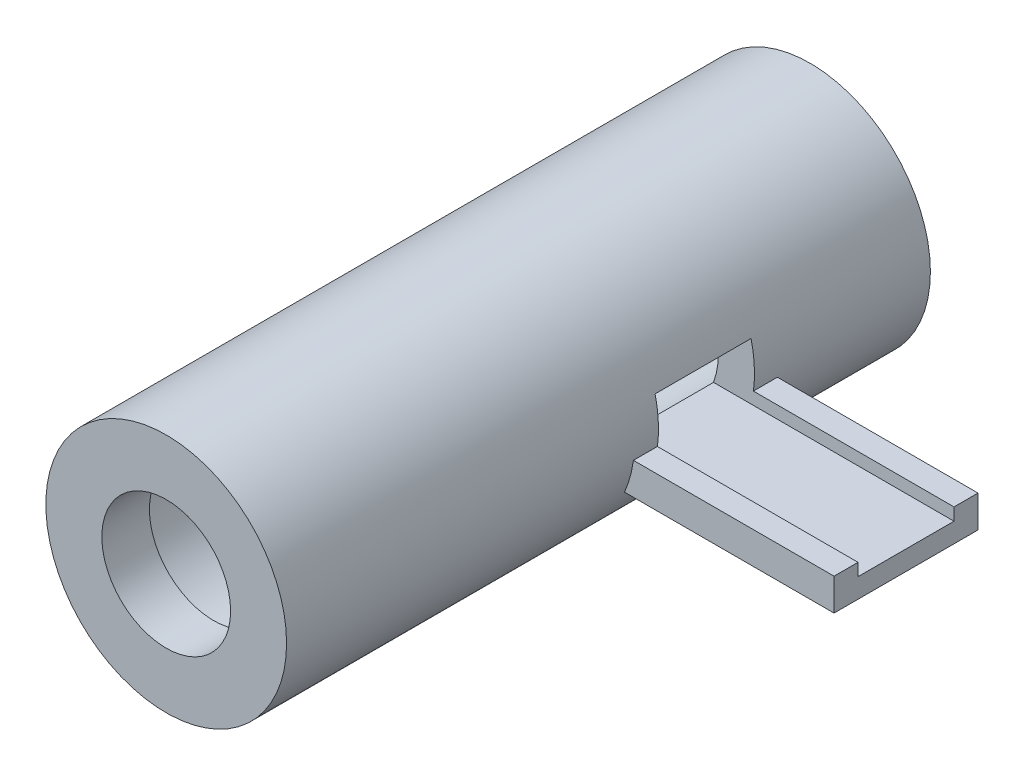
ISO-10303-21;
HEADER;
FILE_DESCRIPTION(('STEP AP214'),'2;1');
FILE_NAME('part.step','',(''),(''),'','','');
FILE_SCHEMA(('AUTOMOTIVE_DESIGN { 1 0 10303 214 1 1 1 1 }'));
ENDSEC;
DATA;
#1=APPLICATION_CONTEXT('core data for automotive mechanical design processes');
#2=APPLICATION_PROTOCOL_DEFINITION('international standard','automotive_design',2000,#1);
#3=PRODUCT_CONTEXT('',#1,'mechanical');
#4=PRODUCT('Part','Part','',(#3));
#5=PRODUCT_RELATED_PRODUCT_CATEGORY('part','',(#4));
#6=PRODUCT_DEFINITION_FORMATION('','',#4);
#7=PRODUCT_DEFINITION_CONTEXT('part definition',#1,'design');
#8=PRODUCT_DEFINITION('design','',#6,#7);
#9=PRODUCT_DEFINITION_SHAPE('','',#8);
#10=(LENGTH_UNIT() NAMED_UNIT(*) SI_UNIT(.MILLI.,.METRE.));
#11=(NAMED_UNIT(*) PLANE_ANGLE_UNIT() SI_UNIT($,.RADIAN.));
#12=(NAMED_UNIT(*) SI_UNIT($,.STERADIAN.) SOLID_ANGLE_UNIT());
#13=UNCERTAINTY_MEASURE_WITH_UNIT(LENGTH_MEASURE(1.E-05),#10,'distance_accuracy_value','');
#14=(GEOMETRIC_REPRESENTATION_CONTEXT(3) GLOBAL_UNCERTAINTY_ASSIGNED_CONTEXT((#13)) GLOBAL_UNIT_ASSIGNED_CONTEXT((#10,
#11,#12)) REPRESENTATION_CONTEXT('',''));
#15=CARTESIAN_POINT('',(0.,0.,0.));
#16=DIRECTION('',(0.,0.,1.));
#17=DIRECTION('',(1.,0.,0.));
#18=AXIS2_PLACEMENT_3D('',#15,#16,#17);
#19=CARTESIAN_POINT('',(0.,0.,0.));
#20=DIRECTION('',(0.,0.,1.));
#21=DIRECTION('',(1.,0.,0.));
#22=AXIS2_PLACEMENT_3D('',#19,#20,#21);
#23=CYLINDRICAL_SURFACE('',#22,15.05);
#24=CARTESIAN_POINT('',(0.,0.,-80.5));
#25=DIRECTION('',(0.,0.,1.));
#26=DIRECTION('',(1.,0.,0.));
#27=AXIS2_PLACEMENT_3D('',#24,#25,#26);
#28=CIRCLE('',#27,15.05);
#29=CARTESIAN_POINT('',(15.05,0.,-80.5));
#30=VERTEX_POINT('',#29);
#31=EDGE_CURVE('E161',#30,#30,#28,.T.);
#32=ORIENTED_EDGE('',*,*,#31,.T.);
#33=EDGE_LOOP('',(#32));
#34=FACE_BOUND('',#33,.T.);
#35=CARTESIAN_POINT('',(0.,0.,0.));
#36=DIRECTION('',(0.,0.,1.));
#37=DIRECTION('',(1.,0.,0.));
#38=AXIS2_PLACEMENT_3D('',#35,#36,#37);
#39=CIRCLE('',#38,15.05);
#40=CARTESIAN_POINT('',(15.05,0.,0.));
#41=VERTEX_POINT('',#40);
#42=EDGE_CURVE('E164',#41,#41,#39,.T.);
#43=ORIENTED_EDGE('',*,*,#42,.F.);
#44=EDGE_LOOP('',(#43));
#45=FACE_BOUND('',#44,.T.);
#46=CARTESIAN_POINT('',(0.,0.,-43.5));
#47=DIRECTION('',(0.,0.,-1.));
#48=DIRECTION('',(-1.,0.,0.));
#49=AXIS2_PLACEMENT_3D('',#46,#47,#48);
#50=CIRCLE('',#49,15.05);
#51=CARTESIAN_POINT('',(13.8022643069896,-6.,-43.5));
#52=VERTEX_POINT('',#51);
#53=CARTESIAN_POINT('',(14.9165176901313,-2.,-43.5));
#54=VERTEX_POINT('',#53);
#55=EDGE_CURVE('E134',#52,#54,#50,.F.);
#56=ORIENTED_EDGE('',*,*,#55,.T.);
#57=DIRECTION('',(0.,0.,1.));
#58=VECTOR('',#57,1.);
#59=CARTESIAN_POINT('',(14.9165176901313,-2.,0.));
#60=LINE('',#59,#58);
#61=CARTESIAN_POINT('',(14.9165176901313,-2.,-46.5));
#62=VERTEX_POINT('',#61);
#63=EDGE_CURVE('E238',#54,#62,#60,.F.);
#64=ORIENTED_EDGE('',*,*,#63,.T.);
#65=CARTESIAN_POINT('',(0.,0.,-46.5));
#66=DIRECTION('',(0.,0.,-1.));
#67=DIRECTION('',(-1.,0.,0.));
#68=AXIS2_PLACEMENT_3D('',#65,#66,#67);
#69=CIRCLE('',#68,15.05);
#70=CARTESIAN_POINT('',(14.6253205093085,3.55,-46.5));
#71=VERTEX_POINT('',#70);
#72=EDGE_CURVE('E50',#62,#71,#69,.F.);
#73=ORIENTED_EDGE('',*,*,#72,.T.);
#74=DIRECTION('',(0.,0.,1.));
#75=VECTOR('',#74,1.);
#76=CARTESIAN_POINT('',(14.6253205093085,3.54999999999998,0.));
#77=LINE('',#76,#75);
#78=CARTESIAN_POINT('',(14.6253205093085,3.55,-58.5));
#79=VERTEX_POINT('',#78);
#80=EDGE_CURVE('E147',#71,#79,#77,.F.);
#81=ORIENTED_EDGE('',*,*,#80,.T.);
#82=CARTESIAN_POINT('',(0.,0.,-58.5));
#83=DIRECTION('',(0.,0.,1.));
#84=DIRECTION('',(0.,-1.,0.));
#85=AXIS2_PLACEMENT_3D('',#82,#83,#84);
#86=CIRCLE('',#85,15.05);
#87=CARTESIAN_POINT('',(14.9165176901313,-2.,-58.5));
#88=VERTEX_POINT('',#87);
#89=EDGE_CURVE('E149',#79,#88,#86,.F.);
#90=ORIENTED_EDGE('',*,*,#89,.T.);
#91=DIRECTION('',(0.,0.,1.));
#92=VECTOR('',#91,1.);
#93=CARTESIAN_POINT('',(14.9165176901313,-2.,0.));
#94=LINE('',#93,#92);
#95=CARTESIAN_POINT('',(14.9165176901313,-2.,-61.5));
#96=VERTEX_POINT('',#95);
#97=EDGE_CURVE('E241',#88,#96,#94,.F.);
#98=ORIENTED_EDGE('',*,*,#97,.T.);
#99=CARTESIAN_POINT('',(0.,0.,-61.5));
#100=DIRECTION('',(0.,0.,1.));
#101=DIRECTION('',(1.,0.,0.));
#102=AXIS2_PLACEMENT_3D('',#99,#100,#101);
#103=CIRCLE('',#102,15.05);
#104=CARTESIAN_POINT('',(13.8022643069896,-6.,-61.5));
#105=VERTEX_POINT('',#104);
#106=EDGE_CURVE('E250',#96,#105,#103,.F.);
#107=ORIENTED_EDGE('',*,*,#106,.T.);
#108=DIRECTION('',(0.,0.,1.));
#109=VECTOR('',#108,1.);
#110=CARTESIAN_POINT('',(13.8022643069896,-5.99999999999999,0.));
#111=LINE('',#110,#109);
#112=EDGE_CURVE('E139',#105,#52,#111,.T.);
#113=ORIENTED_EDGE('',*,*,#112,.T.);
#114=EDGE_LOOP('',(#56,#64,#73,#81,#90,#98,#107,#113));
#115=FACE_BOUND('',#114,.T.);
#116=ADVANCED_FACE('F35',(#34,#45,#115),#23,.T.);
#117=CARTESIAN_POINT('',(0.,0.,0.));
#118=DIRECTION('',(0.,0.,1.));
#119=DIRECTION('',(1.,0.,0.));
#120=AXIS2_PLACEMENT_3D('',#117,#118,#119);
#121=CYLINDRICAL_SURFACE('',#120,10.55);
#122=DIRECTION('',(0.,0.,1.));
#123=VECTOR('',#122,1.);
#124=CARTESIAN_POINT('',(9.93478736561583,-3.55000000000001,-80.5));
#125=LINE('',#124,#123);
#126=CARTESIAN_POINT('',(9.93478736561583,-3.55000000000001,-58.5));
#127=VERTEX_POINT('',#126);
#128=CARTESIAN_POINT('',(9.93478736561583,-3.55000000000001,-46.5));
#129=VERTEX_POINT('',#128);
#130=EDGE_CURVE('E114',#127,#129,#125,.T.);
#131=ORIENTED_EDGE('',*,*,#130,.F.);
#132=CARTESIAN_POINT('',(0.,0.,-58.5));
#133=DIRECTION('',(0.,0.,1.));
#134=DIRECTION('',(0.,-1.,0.));
#135=AXIS2_PLACEMENT_3D('',#132,#133,#134);
#136=CIRCLE('',#135,10.55);
#137=CARTESIAN_POINT('',(9.93478736561584,3.55,-58.5));
#138=VERTEX_POINT('',#137);
#139=EDGE_CURVE('E11',#127,#138,#136,.T.);
#140=ORIENTED_EDGE('',*,*,#139,.T.);
#141=DIRECTION('',(0.,0.,1.));
#142=VECTOR('',#141,1.);
#143=CARTESIAN_POINT('',(9.93478736561585,3.54999999999998,0.));
#144=LINE('',#143,#142);
#145=CARTESIAN_POINT('',(9.93478736561584,3.55,-46.5));
#146=VERTEX_POINT('',#145);
#147=EDGE_CURVE('E43',#138,#146,#144,.T.);
#148=ORIENTED_EDGE('',*,*,#147,.T.);
#149=CARTESIAN_POINT('',(0.,0.,-46.5));
#150=DIRECTION('',(0.,0.,-1.));
#151=DIRECTION('',(-1.,0.,0.));
#152=AXIS2_PLACEMENT_3D('',#149,#150,#151);
#153=CIRCLE('',#152,10.55);
#154=EDGE_CURVE('E110',#146,#129,#153,.T.);
#155=ORIENTED_EDGE('',*,*,#154,.T.);
#156=EDGE_LOOP('',(#131,#140,#148,#155));
#157=FACE_BOUND('',#156,.T.);
#158=CARTESIAN_POINT('',(0.,0.,-5.95));
#159=DIRECTION('',(0.,0.,1.));
#160=DIRECTION('',(1.,0.,0.));
#161=AXIS2_PLACEMENT_3D('',#158,#159,#160);
#162=CIRCLE('',#161,10.55);
#163=CARTESIAN_POINT('',(10.55,0.,-5.95));
#164=VERTEX_POINT('',#163);
#165=EDGE_CURVE('E155',#164,#164,#162,.T.);
#166=ORIENTED_EDGE('',*,*,#165,.T.);
#167=EDGE_LOOP('',(#166));
#168=FACE_BOUND('',#167,.T.);
#169=CARTESIAN_POINT('',(0.,0.,-80.5));
#170=DIRECTION('',(0.,0.,1.));
#171=DIRECTION('',(1.,0.,0.));
#172=AXIS2_PLACEMENT_3D('',#169,#170,#171);
#173=CIRCLE('',#172,10.55);
#174=CARTESIAN_POINT('',(10.55,0.,-80.5));
#175=VERTEX_POINT('',#174);
#176=EDGE_CURVE('E158',#175,#175,#173,.T.);
#177=ORIENTED_EDGE('',*,*,#176,.F.);
#178=EDGE_LOOP('',(#177));
#179=FACE_BOUND('',#178,.T.);
#180=ADVANCED_FACE('F112',(#157,#168,#179),#121,.F.);
#181=CARTESIAN_POINT('',(0.,0.,0.));
#182=DIRECTION('',(0.,0.,1.));
#183=DIRECTION('',(1.,0.,0.));
#184=AXIS2_PLACEMENT_3D('',#181,#182,#183);
#185=CYLINDRICAL_SURFACE('',#184,8.05);
#186=CARTESIAN_POINT('',(0.,0.,0.));
#187=DIRECTION('',(0.,0.,1.));
#188=DIRECTION('',(1.,0.,0.));
#189=AXIS2_PLACEMENT_3D('',#186,#187,#188);
#190=CIRCLE('',#189,8.05);
#191=CARTESIAN_POINT('',(8.05,0.,0.));
#192=VERTEX_POINT('',#191);
#193=EDGE_CURVE('E119',#192,#192,#190,.T.);
#194=ORIENTED_EDGE('',*,*,#193,.T.);
#195=EDGE_LOOP('',(#194));
#196=FACE_BOUND('',#195,.T.);
#197=CARTESIAN_POINT('',(0.,0.,-5.95));
#198=DIRECTION('',(0.,0.,1.));
#199=DIRECTION('',(1.,0.,0.));
#200=AXIS2_PLACEMENT_3D('',#197,#198,#199);
#201=CIRCLE('',#200,8.05);
#202=CARTESIAN_POINT('',(8.05,0.,-5.95));
#203=VERTEX_POINT('',#202);
#204=EDGE_CURVE('E152',#203,#203,#201,.T.);
#205=ORIENTED_EDGE('',*,*,#204,.F.);
#206=EDGE_LOOP('',(#205));
#207=FACE_BOUND('',#206,.T.);
#208=ADVANCED_FACE('F37',(#196,#207),#185,.F.);
#209=CARTESIAN_POINT('',(8.05,0.,0.));
#210=DIRECTION('',(0.,0.,1.));
#211=DIRECTION('',(1.,0.,0.));
#212=AXIS2_PLACEMENT_3D('',#209,#210,#211);
#213=PLANE('',#212);
#214=ORIENTED_EDGE('',*,*,#42,.T.);
#215=EDGE_LOOP('',(#214));
#216=FACE_BOUND('',#215,.T.);
#217=ORIENTED_EDGE('',*,*,#193,.F.);
#218=EDGE_LOOP('',(#217));
#219=FACE_BOUND('',#218,.T.);
#220=ADVANCED_FACE('F172',(#216,#219),#213,.T.);
#221=CARTESIAN_POINT('',(15.05,0.,-80.5));
#222=DIRECTION('',(0.,0.,-1.));
#223=DIRECTION('',(-1.,0.,0.));
#224=AXIS2_PLACEMENT_3D('',#221,#222,#223);
#225=PLANE('',#224);
#226=ORIENTED_EDGE('',*,*,#176,.T.);
#227=EDGE_LOOP('',(#226));
#228=FACE_BOUND('',#227,.T.);
#229=ORIENTED_EDGE('',*,*,#31,.F.);
#230=EDGE_LOOP('',(#229));
#231=FACE_BOUND('',#230,.T.);
#232=ADVANCED_FACE('F174',(#228,#231),#225,.T.);
#233=CARTESIAN_POINT('',(10.55,0.,-5.95));
#234=DIRECTION('',(0.,0.,-1.));
#235=DIRECTION('',(-1.,0.,0.));
#236=AXIS2_PLACEMENT_3D('',#233,#234,#235);
#237=PLANE('',#236);
#238=ORIENTED_EDGE('',*,*,#204,.T.);
#239=EDGE_LOOP('',(#238));
#240=FACE_BOUND('',#239,.T.);
#241=ORIENTED_EDGE('',*,*,#165,.F.);
#242=EDGE_LOOP('',(#241));
#243=FACE_BOUND('',#242,.T.);
#244=ADVANCED_FACE('F180',(#240,#243),#237,.T.);
#245=CARTESIAN_POINT('',(30.,-3.55000000000001,0.));
#246=DIRECTION('',(0.,-1.,0.));
#247=DIRECTION('',(0.,0.,-1.));
#248=AXIS2_PLACEMENT_3D('',#245,#246,#247);
#249=PLANE('',#248);
#250=DIRECTION('',(-1.,0.,0.));
#251=VECTOR('',#250,1.);
#252=CARTESIAN_POINT('',(30.,-3.55000000000001,-58.5));
#253=LINE('',#252,#251);
#254=CARTESIAN_POINT('',(40.,-3.55000000000001,-58.5));
#255=VERTEX_POINT('',#254);
#256=EDGE_CURVE('E126',#255,#127,#253,.T.);
#257=ORIENTED_EDGE('',*,*,#256,.T.);
#258=ORIENTED_EDGE('',*,*,#130,.T.);
#259=DIRECTION('',(-1.,0.,0.));
#260=VECTOR('',#259,1.);
#261=CARTESIAN_POINT('',(30.,-3.55000000000001,-46.5));
#262=LINE('',#261,#260);
#263=CARTESIAN_POINT('',(40.,-3.55000000000001,-46.5));
#264=VERTEX_POINT('',#263);
#265=EDGE_CURVE('E124',#264,#129,#262,.T.);
#266=ORIENTED_EDGE('',*,*,#265,.F.);
#267=DIRECTION('',(0.,0.,1.));
#268=VECTOR('',#267,1.);
#269=CARTESIAN_POINT('',(40.,-3.55000000000001,-46.5));
#270=LINE('',#269,#268);
#271=EDGE_CURVE('E235',#255,#264,#270,.T.);
#272=ORIENTED_EDGE('',*,*,#271,.F.);
#273=EDGE_LOOP('',(#257,#258,#266,#272));
#274=FACE_BOUND('',#273,.T.);
#275=ADVANCED_FACE('F122',(#274),#249,.F.);
#276=CARTESIAN_POINT('',(30.,1.14345153064387E-13,-58.5));
#277=DIRECTION('',(0.,0.,1.));
#278=DIRECTION('',(0.,-1.,0.));
#279=AXIS2_PLACEMENT_3D('',#276,#277,#278);
#280=PLANE('',#279);
#281=ORIENTED_EDGE('',*,*,#139,.F.);
#282=ORIENTED_EDGE('',*,*,#256,.F.);
#283=DIRECTION('',(0.,-1.,0.));
#284=VECTOR('',#283,1.);
#285=CARTESIAN_POINT('',(40.,-3.55000000000001,-58.5));
#286=LINE('',#285,#284);
#287=CARTESIAN_POINT('',(40.,-2.,-58.5));
#288=VERTEX_POINT('',#287);
#289=EDGE_CURVE('E271',#288,#255,#286,.T.);
#290=ORIENTED_EDGE('',*,*,#289,.F.);
#291=DIRECTION('',(-1.,0.,0.));
#292=VECTOR('',#291,1.);
#293=CARTESIAN_POINT('',(40.,-2.,-58.5));
#294=LINE('',#293,#292);
#295=EDGE_CURVE('E265',#288,#88,#294,.T.);
#296=ORIENTED_EDGE('',*,*,#295,.T.);
#297=ORIENTED_EDGE('',*,*,#89,.F.);
#298=DIRECTION('',(-1.,0.,0.));
#299=VECTOR('',#298,1.);
#300=CARTESIAN_POINT('',(30.,3.55,-58.5));
#301=LINE('',#300,#299);
#302=EDGE_CURVE('E136',#79,#138,#301,.T.);
#303=ORIENTED_EDGE('',*,*,#302,.T.);
#304=EDGE_LOOP('',(#281,#282,#290,#296,#297,#303));
#305=FACE_BOUND('',#304,.T.);
#306=ADVANCED_FACE('F197',(#305),#280,.T.);
#307=CARTESIAN_POINT('',(30.,3.54999999999998,0.));
#308=DIRECTION('',(0.,-1.,0.));
#309=DIRECTION('',(0.,0.,-1.));
#310=AXIS2_PLACEMENT_3D('',#307,#308,#309);
#311=PLANE('',#310);
#312=DIRECTION('',(-1.,0.,0.));
#313=VECTOR('',#312,1.);
#314=CARTESIAN_POINT('',(30.,3.55,-46.5));
#315=LINE('',#314,#313);
#316=EDGE_CURVE('E133',#71,#146,#315,.T.);
#317=ORIENTED_EDGE('',*,*,#316,.T.);
#318=ORIENTED_EDGE('',*,*,#147,.F.);
#319=ORIENTED_EDGE('',*,*,#302,.F.);
#320=ORIENTED_EDGE('',*,*,#80,.F.);
#321=EDGE_LOOP('',(#317,#318,#319,#320));
#322=FACE_BOUND('',#321,.T.);
#323=ADVANCED_FACE('F200',(#322),#311,.T.);
#324=CARTESIAN_POINT('',(30.,0.,-46.5));
#325=DIRECTION('',(0.,0.,-1.));
#326=DIRECTION('',(-1.,0.,0.));
#327=AXIS2_PLACEMENT_3D('',#324,#325,#326);
#328=PLANE('',#327);
#329=ORIENTED_EDGE('',*,*,#265,.T.);
#330=ORIENTED_EDGE('',*,*,#154,.F.);
#331=ORIENTED_EDGE('',*,*,#316,.F.);
#332=ORIENTED_EDGE('',*,*,#72,.F.);
#333=DIRECTION('',(-1.,0.,0.));
#334=VECTOR('',#333,1.);
#335=CARTESIAN_POINT('',(40.,-2.,-46.5));
#336=LINE('',#335,#334);
#337=CARTESIAN_POINT('',(40.,-2.,-46.5));
#338=VERTEX_POINT('',#337);
#339=EDGE_CURVE('E237',#338,#62,#336,.T.);
#340=ORIENTED_EDGE('',*,*,#339,.F.);
#341=DIRECTION('',(0.,1.,0.));
#342=VECTOR('',#341,1.);
#343=CARTESIAN_POINT('',(40.,-2.,-46.5));
#344=LINE('',#343,#342);
#345=EDGE_CURVE('E127',#264,#338,#344,.T.);
#346=ORIENTED_EDGE('',*,*,#345,.F.);
#347=EDGE_LOOP('',(#329,#330,#331,#332,#340,#346));
#348=FACE_BOUND('',#347,.T.);
#349=ADVANCED_FACE('F130',(#348),#328,.T.);
#350=CARTESIAN_POINT('',(40.,-2.,-43.5));
#351=DIRECTION('',(0.,0.,-1.));
#352=DIRECTION('',(-1.,0.,0.));
#353=AXIS2_PLACEMENT_3D('',#350,#351,#352);
#354=PLANE('',#353);
#355=ORIENTED_EDGE('',*,*,#55,.F.);
#356=DIRECTION('',(-1.,0.,0.));
#357=VECTOR('',#356,1.);
#358=CARTESIAN_POINT('',(40.,-6.,-43.5));
#359=LINE('',#358,#357);
#360=CARTESIAN_POINT('',(40.,-6.,-43.5));
#361=VERTEX_POINT('',#360);
#362=EDGE_CURVE('E244',#361,#52,#359,.T.);
#363=ORIENTED_EDGE('',*,*,#362,.F.);
#364=DIRECTION('',(0.,-1.,0.));
#365=VECTOR('',#364,1.);
#366=CARTESIAN_POINT('',(40.,-2.,-43.5));
#367=LINE('',#366,#365);
#368=CARTESIAN_POINT('',(40.,-2.,-43.5));
#369=VERTEX_POINT('',#368);
#370=EDGE_CURVE('E278',#369,#361,#367,.T.);
#371=ORIENTED_EDGE('',*,*,#370,.F.);
#372=DIRECTION('',(-1.,0.,0.));
#373=VECTOR('',#372,1.);
#374=CARTESIAN_POINT('',(40.,-2.,-43.5));
#375=LINE('',#374,#373);
#376=EDGE_CURVE('E239',#369,#54,#375,.T.);
#377=ORIENTED_EDGE('',*,*,#376,.T.);
#378=EDGE_LOOP('',(#355,#363,#371,#377));
#379=FACE_BOUND('',#378,.T.);
#380=ADVANCED_FACE('F207',(#379),#354,.F.);
#381=CARTESIAN_POINT('',(40.,-6.,-52.5));
#382=DIRECTION('',(0.,1.,0.));
#383=DIRECTION('',(0.,0.,1.));
#384=AXIS2_PLACEMENT_3D('',#381,#382,#383);
#385=PLANE('',#384);
#386=ORIENTED_EDGE('',*,*,#112,.F.);
#387=DIRECTION('',(-1.,0.,0.));
#388=VECTOR('',#387,1.);
#389=CARTESIAN_POINT('',(40.,-6.,-61.5));
#390=LINE('',#389,#388);
#391=CARTESIAN_POINT('',(40.,-6.,-61.5));
#392=VERTEX_POINT('',#391);
#393=EDGE_CURVE('E257',#392,#105,#390,.T.);
#394=ORIENTED_EDGE('',*,*,#393,.F.);
#395=DIRECTION('',(0.,0.,-1.));
#396=VECTOR('',#395,1.);
#397=CARTESIAN_POINT('',(40.,-6.,-52.5));
#398=LINE('',#397,#396);
#399=EDGE_CURVE('E276',#361,#392,#398,.T.);
#400=ORIENTED_EDGE('',*,*,#399,.F.);
#401=ORIENTED_EDGE('',*,*,#362,.T.);
#402=EDGE_LOOP('',(#386,#394,#400,#401));
#403=FACE_BOUND('',#402,.T.);
#404=ADVANCED_FACE('F216',(#403),#385,.F.);
#405=CARTESIAN_POINT('',(40.,-2.,-61.5));
#406=DIRECTION('',(0.,0.,1.));
#407=DIRECTION('',(1.,0.,0.));
#408=AXIS2_PLACEMENT_3D('',#405,#406,#407);
#409=PLANE('',#408);
#410=ORIENTED_EDGE('',*,*,#106,.F.);
#411=DIRECTION('',(-1.,0.,0.));
#412=VECTOR('',#411,1.);
#413=CARTESIAN_POINT('',(40.,-2.,-61.5));
#414=LINE('',#413,#412);
#415=CARTESIAN_POINT('',(40.,-2.,-61.5));
#416=VERTEX_POINT('',#415);
#417=EDGE_CURVE('E263',#416,#96,#414,.T.);
#418=ORIENTED_EDGE('',*,*,#417,.F.);
#419=DIRECTION('',(0.,1.,0.));
#420=VECTOR('',#419,1.);
#421=CARTESIAN_POINT('',(40.,-2.,-61.5));
#422=LINE('',#421,#420);
#423=EDGE_CURVE('E262',#392,#416,#422,.T.);
#424=ORIENTED_EDGE('',*,*,#423,.F.);
#425=ORIENTED_EDGE('',*,*,#393,.T.);
#426=EDGE_LOOP('',(#410,#418,#424,#425));
#427=FACE_BOUND('',#426,.T.);
#428=ADVANCED_FACE('F220',(#427),#409,.F.);
#429=CARTESIAN_POINT('',(40.,-2.,-58.5));
#430=DIRECTION('',(0.,-1.,0.));
#431=DIRECTION('',(0.,0.,-1.));
#432=AXIS2_PLACEMENT_3D('',#429,#430,#431);
#433=PLANE('',#432);
#434=ORIENTED_EDGE('',*,*,#97,.F.);
#435=ORIENTED_EDGE('',*,*,#295,.F.);
#436=DIRECTION('',(0.,0.,1.));
#437=VECTOR('',#436,1.);
#438=CARTESIAN_POINT('',(40.,-2.,-58.5));
#439=LINE('',#438,#437);
#440=EDGE_CURVE('E273',#416,#288,#439,.T.);
#441=ORIENTED_EDGE('',*,*,#440,.F.);
#442=ORIENTED_EDGE('',*,*,#417,.T.);
#443=EDGE_LOOP('',(#434,#435,#441,#442));
#444=FACE_BOUND('',#443,.T.);
#445=ADVANCED_FACE('F212',(#444),#433,.F.);
#446=CARTESIAN_POINT('',(40.,-2.,-46.5));
#447=DIRECTION('',(0.,-1.,0.));
#448=DIRECTION('',(0.,0.,-1.));
#449=AXIS2_PLACEMENT_3D('',#446,#447,#448);
#450=PLANE('',#449);
#451=ORIENTED_EDGE('',*,*,#63,.F.);
#452=ORIENTED_EDGE('',*,*,#376,.F.);
#453=DIRECTION('',(0.,0.,1.));
#454=VECTOR('',#453,1.);
#455=CARTESIAN_POINT('',(40.,-2.,-46.5));
#456=LINE('',#455,#454);
#457=EDGE_CURVE('E232',#338,#369,#456,.T.);
#458=ORIENTED_EDGE('',*,*,#457,.F.);
#459=ORIENTED_EDGE('',*,*,#339,.T.);
#460=EDGE_LOOP('',(#451,#452,#458,#459));
#461=FACE_BOUND('',#460,.T.);
#462=ADVANCED_FACE('F208',(#461),#450,.F.);
#463=CARTESIAN_POINT('',(40.,0.,0.));
#464=DIRECTION('',(1.,0.,0.));
#465=DIRECTION('',(0.,0.,-1.));
#466=AXIS2_PLACEMENT_3D('',#463,#464,#465);
#467=PLANE('',#466);
#468=ORIENTED_EDGE('',*,*,#345,.T.);
#469=ORIENTED_EDGE('',*,*,#457,.T.);
#470=ORIENTED_EDGE('',*,*,#370,.T.);
#471=ORIENTED_EDGE('',*,*,#399,.T.);
#472=ORIENTED_EDGE('',*,*,#423,.T.);
#473=ORIENTED_EDGE('',*,*,#440,.T.);
#474=ORIENTED_EDGE('',*,*,#289,.T.);
#475=ORIENTED_EDGE('',*,*,#271,.T.);
#476=EDGE_LOOP('',(#468,#469,#470,#471,#472,#473,#474,#475));
#477=FACE_BOUND('',#476,.T.);
#478=ADVANCED_FACE('F211',(#477),#467,.T.);
#479=CLOSED_SHELL('',(#116,#180,#208,#220,#232,#244,#275,#306,#323,#349,#380,#404,#428,#445,
#462,#478));
#480=MANIFOLD_SOLID_BREP('B2',#479);
#481=ADVANCED_BREP_SHAPE_REPRESENTATION('',(#18,#480),#14);
#482=SHAPE_DEFINITION_REPRESENTATION(#9,#481);
ENDSEC;
END-ISO-10303-21;
